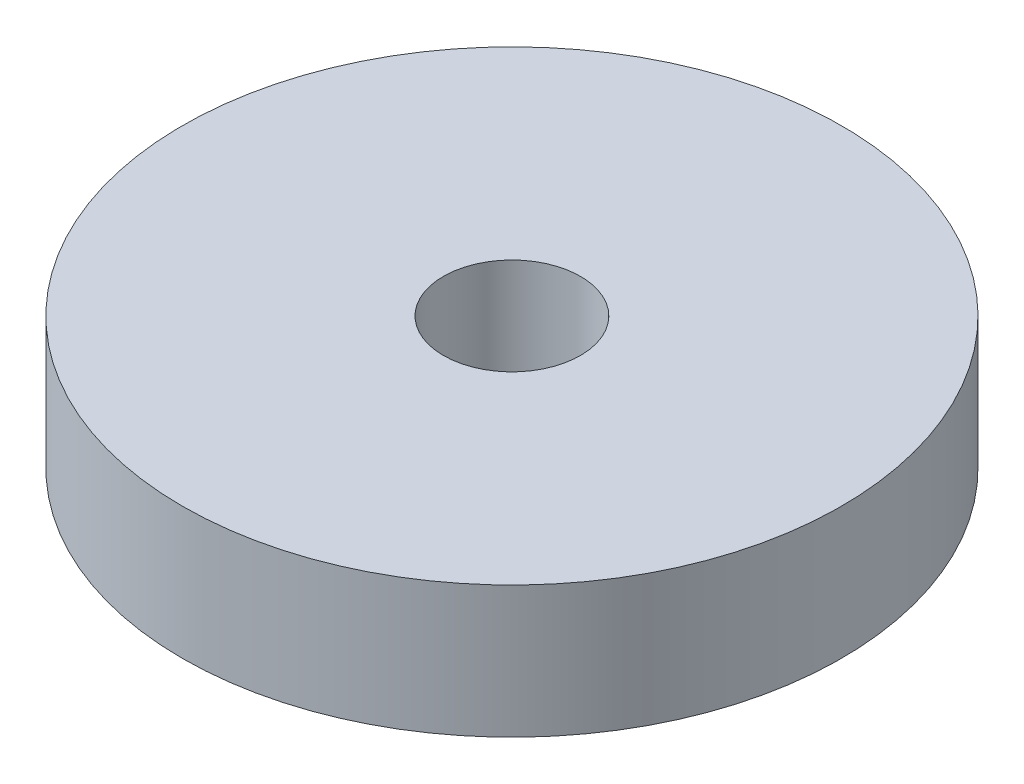
ISO-10303-21;
HEADER;
FILE_DESCRIPTION(('STEP AP214'),'2;1');
FILE_NAME('part.step','',(''),(''),'','','');
FILE_SCHEMA(('AUTOMOTIVE_DESIGN { 1 0 10303 214 1 1 1 1 }'));
ENDSEC;
DATA;
#1=APPLICATION_CONTEXT('core data for automotive mechanical design processes');
#2=APPLICATION_PROTOCOL_DEFINITION('international standard','automotive_design',2000,#1);
#3=PRODUCT_CONTEXT('',#1,'mechanical');
#4=PRODUCT('Part','Part','',(#3));
#5=PRODUCT_RELATED_PRODUCT_CATEGORY('part','',(#4));
#6=PRODUCT_DEFINITION_FORMATION('','',#4);
#7=PRODUCT_DEFINITION_CONTEXT('part definition',#1,'design');
#8=PRODUCT_DEFINITION('design','',#6,#7);
#9=PRODUCT_DEFINITION_SHAPE('','',#8);
#10=(LENGTH_UNIT() NAMED_UNIT(*) SI_UNIT(.MILLI.,.METRE.));
#11=(NAMED_UNIT(*) PLANE_ANGLE_UNIT() SI_UNIT($,.RADIAN.));
#12=(NAMED_UNIT(*) SI_UNIT($,.STERADIAN.) SOLID_ANGLE_UNIT());
#13=UNCERTAINTY_MEASURE_WITH_UNIT(LENGTH_MEASURE(1.E-05),#10,'distance_accuracy_value','');
#14=(GEOMETRIC_REPRESENTATION_CONTEXT(3) GLOBAL_UNCERTAINTY_ASSIGNED_CONTEXT((#13)) GLOBAL_UNIT_ASSIGNED_CONTEXT((#10,
#11,#12)) REPRESENTATION_CONTEXT('',''));
#15=CARTESIAN_POINT('',(0.,0.,0.));
#16=DIRECTION('',(0.,0.,1.));
#17=DIRECTION('',(1.,0.,0.));
#18=AXIS2_PLACEMENT_3D('',#15,#16,#17);
#19=CARTESIAN_POINT('',(0.,5.,0.));
#20=DIRECTION('',(0.,1.,0.));
#21=DIRECTION('',(0.,0.,1.));
#22=AXIS2_PLACEMENT_3D('',#19,#20,#21);
#23=PLANE('',#22);
#24=CARTESIAN_POINT('',(0.,5.,0.));
#25=DIRECTION('',(0.,1.,0.));
#26=DIRECTION('',(0.,0.,1.));
#27=AXIS2_PLACEMENT_3D('',#24,#25,#26);
#28=CIRCLE('',#27,12.5);
#29=CARTESIAN_POINT('',(0.,5.,12.5));
#30=VERTEX_POINT('',#29);
#31=EDGE_CURVE('E10',#30,#30,#28,.T.);
#32=ORIENTED_EDGE('',*,*,#31,.T.);
#33=EDGE_LOOP('',(#32));
#34=FACE_BOUND('',#33,.T.);
#35=CARTESIAN_POINT('',(0.,5.,0.));
#36=DIRECTION('',(0.,1.,0.));
#37=DIRECTION('',(0.,0.,1.));
#38=AXIS2_PLACEMENT_3D('',#35,#36,#37);
#39=CIRCLE('',#38,2.6);
#40=CARTESIAN_POINT('',(0.,5.,2.6));
#41=VERTEX_POINT('',#40);
#42=EDGE_CURVE('E54',#41,#41,#39,.T.);
#43=ORIENTED_EDGE('',*,*,#42,.F.);
#44=EDGE_LOOP('',(#43));
#45=FACE_BOUND('',#44,.T.);
#46=ADVANCED_FACE('F41',(#34,#45),#23,.T.);
#47=CARTESIAN_POINT('',(0.,0.,0.));
#48=DIRECTION('',(0.,1.,0.));
#49=DIRECTION('',(0.,0.,1.));
#50=AXIS2_PLACEMENT_3D('',#47,#48,#49);
#51=PLANE('',#50);
#52=CARTESIAN_POINT('',(0.,0.,0.));
#53=DIRECTION('',(0.,1.,0.));
#54=DIRECTION('',(0.,0.,1.));
#55=AXIS2_PLACEMENT_3D('',#52,#53,#54);
#56=CIRCLE('',#55,12.5);
#57=CARTESIAN_POINT('',(0.,0.,12.5));
#58=VERTEX_POINT('',#57);
#59=EDGE_CURVE('E45',#58,#58,#56,.T.);
#60=ORIENTED_EDGE('',*,*,#59,.F.);
#61=EDGE_LOOP('',(#60));
#62=FACE_BOUND('',#61,.T.);
#63=CARTESIAN_POINT('',(0.,0.,0.));
#64=DIRECTION('',(0.,1.,0.));
#65=DIRECTION('',(0.,0.,1.));
#66=AXIS2_PLACEMENT_3D('',#63,#64,#65);
#67=CIRCLE('',#66,2.6);
#68=CARTESIAN_POINT('',(0.,0.,2.6));
#69=VERTEX_POINT('',#68);
#70=EDGE_CURVE('E56',#69,#69,#67,.T.);
#71=ORIENTED_EDGE('',*,*,#70,.T.);
#72=EDGE_LOOP('',(#71));
#73=FACE_BOUND('',#72,.T.);
#74=ADVANCED_FACE('F68',(#62,#73),#51,.F.);
#75=CARTESIAN_POINT('',(0.,5.,0.));
#76=DIRECTION('',(0.,-1.,0.));
#77=DIRECTION('',(0.,0.,-1.));
#78=AXIS2_PLACEMENT_3D('',#75,#76,#77);
#79=CYLINDRICAL_SURFACE('',#78,12.5);
#80=ORIENTED_EDGE('',*,*,#31,.F.);
#81=EDGE_LOOP('',(#80));
#82=FACE_BOUND('',#81,.T.);
#83=ORIENTED_EDGE('',*,*,#59,.T.);
#84=EDGE_LOOP('',(#83));
#85=FACE_BOUND('',#84,.T.);
#86=ADVANCED_FACE('F43',(#82,#85),#79,.T.);
#87=CARTESIAN_POINT('',(0.,5.,0.));
#88=DIRECTION('',(0.,-1.,0.));
#89=DIRECTION('',(0.,0.,-1.));
#90=AXIS2_PLACEMENT_3D('',#87,#88,#89);
#91=CYLINDRICAL_SURFACE('',#90,2.6);
#92=ORIENTED_EDGE('',*,*,#42,.T.);
#93=EDGE_LOOP('',(#92));
#94=FACE_BOUND('',#93,.T.);
#95=ORIENTED_EDGE('',*,*,#70,.F.);
#96=EDGE_LOOP('',(#95));
#97=FACE_BOUND('',#96,.T.);
#98=ADVANCED_FACE('F64',(#94,#97),#91,.F.);
#99=CLOSED_SHELL('',(#46,#74,#86,#98));
#100=MANIFOLD_SOLID_BREP('B2',#99);
#101=ADVANCED_BREP_SHAPE_REPRESENTATION('',(#18,#100),#14);
#102=SHAPE_DEFINITION_REPRESENTATION(#9,#101);
ENDSEC;
END-ISO-10303-21;
